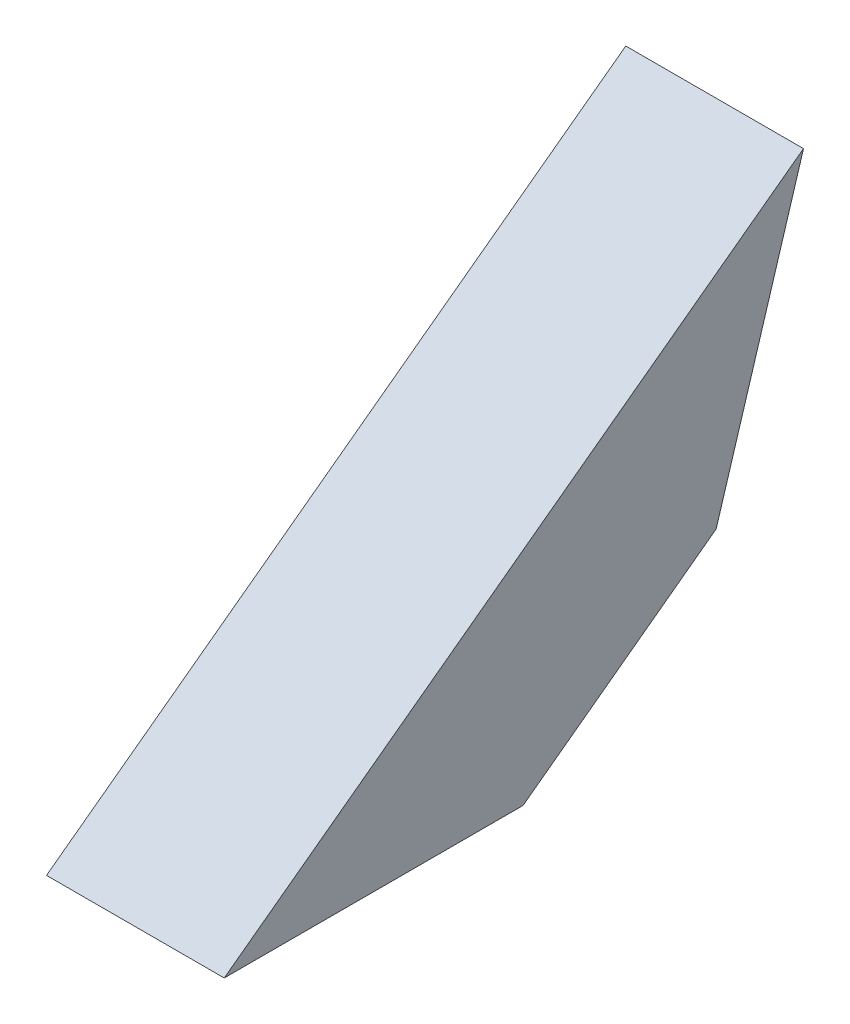
ISO-10303-21;
HEADER;
FILE_DESCRIPTION(('STEP AP214'),'2;1');
FILE_NAME('part.step','',(''),(''),'','','');
FILE_SCHEMA(('AUTOMOTIVE_DESIGN { 1 0 10303 214 1 1 1 1 }'));
ENDSEC;
DATA;
#1=APPLICATION_CONTEXT('core data for automotive mechanical design processes');
#2=APPLICATION_PROTOCOL_DEFINITION('international standard','automotive_design',2000,#1);
#3=PRODUCT_CONTEXT('',#1,'mechanical');
#4=PRODUCT('Part','Part','',(#3));
#5=PRODUCT_RELATED_PRODUCT_CATEGORY('part','',(#4));
#6=PRODUCT_DEFINITION_FORMATION('','',#4);
#7=PRODUCT_DEFINITION_CONTEXT('part definition',#1,'design');
#8=PRODUCT_DEFINITION('design','',#6,#7);
#9=PRODUCT_DEFINITION_SHAPE('','',#8);
#10=(LENGTH_UNIT() NAMED_UNIT(*) SI_UNIT(.MILLI.,.METRE.));
#11=(NAMED_UNIT(*) PLANE_ANGLE_UNIT() SI_UNIT($,.RADIAN.));
#12=(NAMED_UNIT(*) SI_UNIT($,.STERADIAN.) SOLID_ANGLE_UNIT());
#13=UNCERTAINTY_MEASURE_WITH_UNIT(LENGTH_MEASURE(1.E-05),#10,'distance_accuracy_value','');
#14=(GEOMETRIC_REPRESENTATION_CONTEXT(3) GLOBAL_UNCERTAINTY_ASSIGNED_CONTEXT((#13)) GLOBAL_UNIT_ASSIGNED_CONTEXT((#10,
#11,#12)) REPRESENTATION_CONTEXT('',''));
#15=CARTESIAN_POINT('',(0.,0.,0.));
#16=DIRECTION('',(0.,0.,1.));
#17=DIRECTION('',(1.,0.,0.));
#18=AXIS2_PLACEMENT_3D('',#15,#16,#17);
#19=CARTESIAN_POINT('',(10.,0.,0.));
#20=DIRECTION('',(0.,0.803856860617217,0.594822786751342));
#21=DIRECTION('',(0.,-0.594822786751342,0.803856860617217));
#22=AXIS2_PLACEMENT_3D('',#19,#20,#21);
#23=PLANE('',#22);
#24=DIRECTION('',(0.,0.594822786751342,-0.803856860617217));
#25=VECTOR('',#24,1.);
#26=CARTESIAN_POINT('',(0.,0.,0.));
#27=LINE('',#26,#25);
#28=CARTESIAN_POINT('',(0.,0.,0.));
#29=VERTEX_POINT('',#28);
#30=CARTESIAN_POINT('',(0.,8.03856860617214,-10.8635019833478));
#31=VERTEX_POINT('',#30);
#32=EDGE_CURVE('E107',#29,#31,#27,.T.);
#33=ORIENTED_EDGE('',*,*,#32,.T.);
#34=DIRECTION('',(-1.,0.,0.));
#35=VECTOR('',#34,1.);
#36=CARTESIAN_POINT('',(10.,8.03856860617214,-10.8635019833478));
#37=LINE('',#36,#35);
#38=CARTESIAN_POINT('',(10.,8.03856860617214,-10.8635019833478));
#39=VERTEX_POINT('',#38);
#40=EDGE_CURVE('E11',#39,#31,#37,.T.);
#41=ORIENTED_EDGE('',*,*,#40,.F.);
#42=DIRECTION('',(0.,0.594822786751342,-0.803856860617217));
#43=VECTOR('',#42,1.);
#44=CARTESIAN_POINT('',(10.,0.,0.));
#45=LINE('',#44,#43);
#46=CARTESIAN_POINT('',(10.,0.,0.));
#47=VERTEX_POINT('',#46);
#48=EDGE_CURVE('E91',#47,#39,#45,.T.);
#49=ORIENTED_EDGE('',*,*,#48,.F.);
#50=DIRECTION('',(-1.,0.,0.));
#51=VECTOR('',#50,1.);
#52=CARTESIAN_POINT('',(10.,0.,0.));
#53=LINE('',#52,#51);
#54=EDGE_CURVE('E103',#47,#29,#53,.T.);
#55=ORIENTED_EDGE('',*,*,#54,.T.);
#56=EDGE_LOOP('',(#33,#41,#49,#55));
#57=FACE_BOUND('',#56,.T.);
#58=ADVANCED_FACE('F39',(#57),#23,.F.);
#59=CARTESIAN_POINT('',(10.,8.03856860617214,-10.8635019833478));
#60=DIRECTION('',(0.,0.292371704722734,0.956304755963036));
#61=DIRECTION('',(0.,-0.956304755963036,0.292371704722734));
#62=AXIS2_PLACEMENT_3D('',#59,#60,#61);
#63=PLANE('',#62);
#64=DIRECTION('',(0.,0.956304755963036,-0.292371704722734));
#65=VECTOR('',#64,1.);
#66=CARTESIAN_POINT('',(0.,8.03856860617214,-10.8635019833478));
#67=LINE('',#66,#65);
#68=CARTESIAN_POINT('',(0.,24.1157058185165,-15.7787760991822));
#69=VERTEX_POINT('',#68);
#70=EDGE_CURVE('E96',#31,#69,#67,.T.);
#71=ORIENTED_EDGE('',*,*,#70,.T.);
#72=DIRECTION('',(-1.,0.,0.));
#73=VECTOR('',#72,1.);
#74=CARTESIAN_POINT('',(10.,24.1157058185165,-15.7787760991822));
#75=LINE('',#74,#73);
#76=CARTESIAN_POINT('',(10.,24.1157058185165,-15.7787760991822));
#77=VERTEX_POINT('',#76);
#78=EDGE_CURVE('E48',#77,#69,#75,.T.);
#79=ORIENTED_EDGE('',*,*,#78,.F.);
#80=DIRECTION('',(0.,0.956304755963036,-0.292371704722734));
#81=VECTOR('',#80,1.);
#82=CARTESIAN_POINT('',(10.,8.03856860617214,-10.8635019833478));
#83=LINE('',#82,#81);
#84=EDGE_CURVE('E86',#39,#77,#83,.T.);
#85=ORIENTED_EDGE('',*,*,#84,.F.);
#86=ORIENTED_EDGE('',*,*,#40,.T.);
#87=EDGE_LOOP('',(#71,#79,#85,#86));
#88=FACE_BOUND('',#87,.T.);
#89=ADVANCED_FACE('F95',(#88),#63,.F.);
#90=CARTESIAN_POINT('',(10.,24.1157058185165,-15.7787760991822));
#91=DIRECTION('',(0.,-0.803856860617217,-0.594822786751342));
#92=DIRECTION('',(0.,0.594822786751342,-0.803856860617217));
#93=AXIS2_PLACEMENT_3D('',#90,#91,#92);
#94=PLANE('',#93);
#95=DIRECTION('',(0.,-0.594822786751342,0.803856860617217));
#96=VECTOR('',#95,1.);
#97=CARTESIAN_POINT('',(0.,24.1157058185165,-15.7787760991822));
#98=LINE('',#97,#96);
#99=CARTESIAN_POINT('',(0.,0.,16.8117298508612));
#100=VERTEX_POINT('',#99);
#101=EDGE_CURVE('E73',#69,#100,#98,.T.);
#102=ORIENTED_EDGE('',*,*,#101,.T.);
#103=DIRECTION('',(-1.,0.,0.));
#104=VECTOR('',#103,1.);
#105=CARTESIAN_POINT('',(10.,0.,16.8117298508612));
#106=LINE('',#105,#104);
#107=CARTESIAN_POINT('',(10.,0.,16.8117298508612));
#108=VERTEX_POINT('',#107);
#109=EDGE_CURVE('E98',#108,#100,#106,.T.);
#110=ORIENTED_EDGE('',*,*,#109,.F.);
#111=DIRECTION('',(0.,-0.594822786751342,0.803856860617217));
#112=VECTOR('',#111,1.);
#113=CARTESIAN_POINT('',(10.,24.1157058185165,-15.7787760991822));
#114=LINE('',#113,#112);
#115=EDGE_CURVE('E89',#77,#108,#114,.T.);
#116=ORIENTED_EDGE('',*,*,#115,.F.);
#117=ORIENTED_EDGE('',*,*,#78,.T.);
#118=EDGE_LOOP('',(#102,#110,#116,#117));
#119=FACE_BOUND('',#118,.T.);
#120=ADVANCED_FACE('F99',(#119),#94,.F.);
#121=CARTESIAN_POINT('',(10.,0.,16.8117298508612));
#122=DIRECTION('',(0.,1.,0.));
#123=DIRECTION('',(0.,0.,1.));
#124=AXIS2_PLACEMENT_3D('',#121,#122,#123);
#125=PLANE('',#124);
#126=DIRECTION('',(0.,0.,-1.));
#127=VECTOR('',#126,1.);
#128=CARTESIAN_POINT('',(0.,0.,16.8117298508612));
#129=LINE('',#128,#127);
#130=EDGE_CURVE('E79',#100,#29,#129,.T.);
#131=ORIENTED_EDGE('',*,*,#130,.T.);
#132=ORIENTED_EDGE('',*,*,#54,.F.);
#133=DIRECTION('',(0.,0.,-1.));
#134=VECTOR('',#133,1.);
#135=CARTESIAN_POINT('',(10.,0.,16.8117298508612));
#136=LINE('',#135,#134);
#137=EDGE_CURVE('E56',#108,#47,#136,.T.);
#138=ORIENTED_EDGE('',*,*,#137,.F.);
#139=ORIENTED_EDGE('',*,*,#109,.T.);
#140=EDGE_LOOP('',(#131,#132,#138,#139));
#141=FACE_BOUND('',#140,.T.);
#142=ADVANCED_FACE('F120',(#141),#125,.F.);
#143=CARTESIAN_POINT('',(10.,0.,0.));
#144=DIRECTION('',(1.,0.,0.));
#145=DIRECTION('',(0.,0.,-1.));
#146=AXIS2_PLACEMENT_3D('',#143,#144,#145);
#147=PLANE('',#146);
#148=ORIENTED_EDGE('',*,*,#48,.T.);
#149=ORIENTED_EDGE('',*,*,#84,.T.);
#150=ORIENTED_EDGE('',*,*,#115,.T.);
#151=ORIENTED_EDGE('',*,*,#137,.T.);
#152=EDGE_LOOP('',(#148,#149,#150,#151));
#153=FACE_BOUND('',#152,.T.);
#154=ADVANCED_FACE('F87',(#153),#147,.T.);
#155=CARTESIAN_POINT('',(0.,0.,0.));
#156=DIRECTION('',(1.,0.,0.));
#157=DIRECTION('',(0.,0.,-1.));
#158=AXIS2_PLACEMENT_3D('',#155,#156,#157);
#159=PLANE('',#158);
#160=ORIENTED_EDGE('',*,*,#32,.F.);
#161=ORIENTED_EDGE('',*,*,#130,.F.);
#162=ORIENTED_EDGE('',*,*,#101,.F.);
#163=ORIENTED_EDGE('',*,*,#70,.F.);
#164=EDGE_LOOP('',(#160,#161,#162,#163));
#165=FACE_BOUND('',#164,.T.);
#166=ADVANCED_FACE('F123',(#165),#159,.F.);
#167=CLOSED_SHELL('',(#58,#89,#120,#142,#154,#166));
#168=MANIFOLD_SOLID_BREP('B2',#167);
#169=ADVANCED_BREP_SHAPE_REPRESENTATION('',(#18,#168),#14);
#170=SHAPE_DEFINITION_REPRESENTATION(#9,#169);
ENDSEC;
END-ISO-10303-21;
